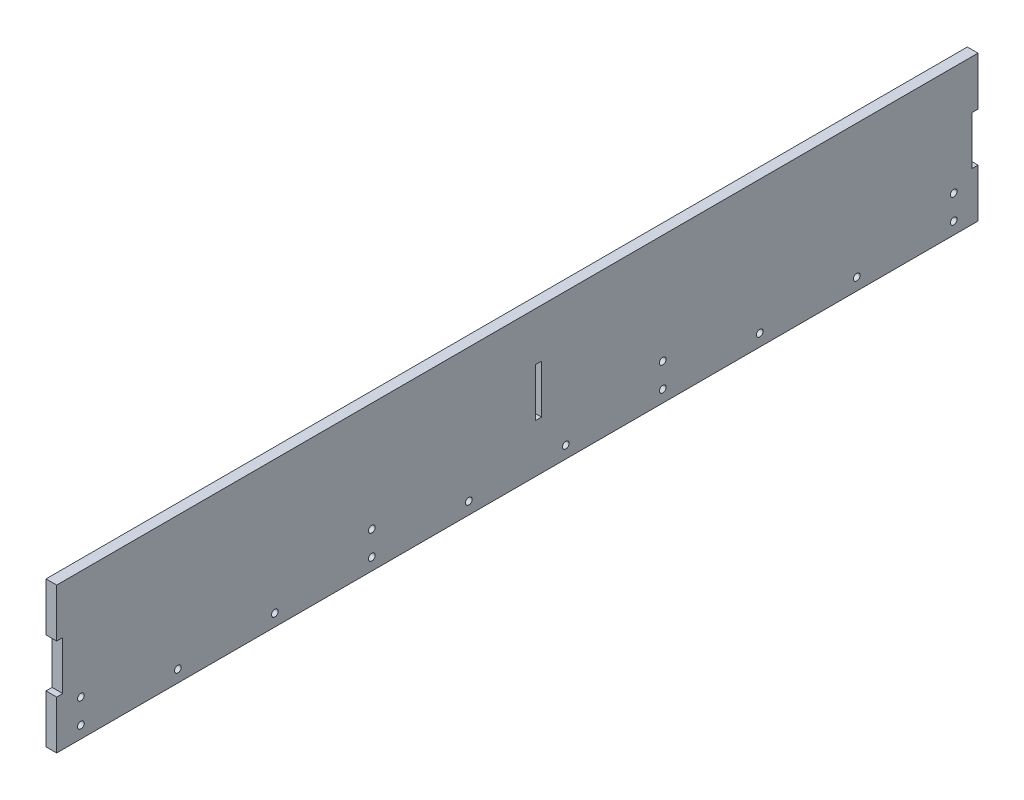
ISO-10303-21;
HEADER;
FILE_DESCRIPTION(('STEP AP214'),'2;1');
FILE_NAME('part.step','',(''),(''),'','','');
FILE_SCHEMA(('AUTOMOTIVE_DESIGN { 1 0 10303 214 1 1 1 1 }'));
ENDSEC;
DATA;
#1=APPLICATION_CONTEXT('core data for automotive mechanical design processes');
#2=APPLICATION_PROTOCOL_DEFINITION('international standard','automotive_design',2000,#1);
#3=PRODUCT_CONTEXT('',#1,'mechanical');
#4=PRODUCT('Part','Part','',(#3));
#5=PRODUCT_RELATED_PRODUCT_CATEGORY('part','',(#4));
#6=PRODUCT_DEFINITION_FORMATION('','',#4);
#7=PRODUCT_DEFINITION_CONTEXT('part definition',#1,'design');
#8=PRODUCT_DEFINITION('design','',#6,#7);
#9=PRODUCT_DEFINITION_SHAPE('','',#8);
#10=(LENGTH_UNIT() NAMED_UNIT(*) SI_UNIT(.MILLI.,.METRE.));
#11=(NAMED_UNIT(*) PLANE_ANGLE_UNIT() SI_UNIT($,.RADIAN.));
#12=(NAMED_UNIT(*) SI_UNIT($,.STERADIAN.) SOLID_ANGLE_UNIT());
#13=UNCERTAINTY_MEASURE_WITH_UNIT(LENGTH_MEASURE(1.E-05),#10,'distance_accuracy_value','');
#14=(GEOMETRIC_REPRESENTATION_CONTEXT(3) GLOBAL_UNCERTAINTY_ASSIGNED_CONTEXT((#13)) GLOBAL_UNIT_ASSIGNED_CONTEXT((#10,
#11,#12)) REPRESENTATION_CONTEXT('',''));
#15=CARTESIAN_POINT('',(0.,0.,0.));
#16=DIRECTION('',(0.,0.,1.));
#17=DIRECTION('',(1.,0.,0.));
#18=AXIS2_PLACEMENT_3D('',#15,#16,#17);
#19=CARTESIAN_POINT('',(88.9,-85.7250000000001,-196.85));
#20=DIRECTION('',(0.,0.,1.));
#21=DIRECTION('',(0.,-1.,0.));
#22=AXIS2_PLACEMENT_3D('',#19,#20,#21);
#23=PLANE('',#22);
#24=DIRECTION('',(0.,-1.,0.));
#25=VECTOR('',#24,1.);
#26=CARTESIAN_POINT('',(94.488,-85.7250000000001,-196.85));
#27=LINE('',#26,#25);
#28=CARTESIAN_POINT('',(94.488,-60.325,-196.85));
#29=VERTEX_POINT('',#28);
#30=CARTESIAN_POINT('',(94.488,-85.7250000000001,-196.85));
#31=VERTEX_POINT('',#30);
#32=EDGE_CURVE('E181',#29,#31,#27,.T.);
#33=ORIENTED_EDGE('',*,*,#32,.F.);
#34=DIRECTION('',(1.,0.,0.));
#35=VECTOR('',#34,1.);
#36=CARTESIAN_POINT('',(88.9,-60.325,-196.85));
#37=LINE('',#36,#35);
#38=CARTESIAN_POINT('',(88.9,-60.325,-196.85));
#39=VERTEX_POINT('',#38);
#40=EDGE_CURVE('E11',#39,#29,#37,.T.);
#41=ORIENTED_EDGE('',*,*,#40,.F.);
#42=DIRECTION('',(0.,-1.,0.));
#43=VECTOR('',#42,1.);
#44=CARTESIAN_POINT('',(88.9,-85.7250000000001,-196.85));
#45=LINE('',#44,#43);
#46=CARTESIAN_POINT('',(88.9,-85.7250000000001,-196.85));
#47=VERTEX_POINT('',#46);
#48=EDGE_CURVE('E185',#39,#47,#45,.T.);
#49=ORIENTED_EDGE('',*,*,#48,.T.);
#50=DIRECTION('',(1.,0.,0.));
#51=VECTOR('',#50,1.);
#52=CARTESIAN_POINT('',(88.9,-85.7250000000001,-196.85));
#53=LINE('',#52,#51);
#54=EDGE_CURVE('E222',#47,#31,#53,.T.);
#55=ORIENTED_EDGE('',*,*,#54,.T.);
#56=EDGE_LOOP('',(#33,#41,#49,#55));
#57=FACE_BOUND('',#56,.T.);
#58=ADVANCED_FACE('F32',(#57),#23,.T.);
#59=CARTESIAN_POINT('',(88.9,-60.325,-196.85));
#60=DIRECTION('',(0.,1.,0.));
#61=DIRECTION('',(0.,0.,1.));
#62=AXIS2_PLACEMENT_3D('',#59,#60,#61);
#63=PLANE('',#62);
#64=DIRECTION('',(0.,0.,1.));
#65=VECTOR('',#64,1.);
#66=CARTESIAN_POINT('',(94.488,-60.325,-196.85));
#67=LINE('',#66,#65);
#68=CARTESIAN_POINT('',(94.488,-60.325,-679.45));
#69=VERTEX_POINT('',#68);
#70=EDGE_CURVE('E189',#69,#29,#67,.T.);
#71=ORIENTED_EDGE('',*,*,#70,.F.);
#72=DIRECTION('',(1.,0.,0.));
#73=VECTOR('',#72,1.);
#74=CARTESIAN_POINT('',(88.9,-60.325,-679.45));
#75=LINE('',#74,#73);
#76=CARTESIAN_POINT('',(88.9,-60.325,-679.45));
#77=VERTEX_POINT('',#76);
#78=EDGE_CURVE('E40',#77,#69,#75,.T.);
#79=ORIENTED_EDGE('',*,*,#78,.F.);
#80=DIRECTION('',(0.,0.,1.));
#81=VECTOR('',#80,1.);
#82=CARTESIAN_POINT('',(88.9,-60.325,-196.85));
#83=LINE('',#82,#81);
#84=EDGE_CURVE('E219',#77,#39,#83,.T.);
#85=ORIENTED_EDGE('',*,*,#84,.T.);
#86=ORIENTED_EDGE('',*,*,#40,.T.);
#87=EDGE_LOOP('',(#71,#79,#85,#86));
#88=FACE_BOUND('',#87,.T.);
#89=ADVANCED_FACE('F417',(#88),#63,.T.);
#90=CARTESIAN_POINT('',(88.9,-60.325,-679.45));
#91=DIRECTION('',(0.,0.,-1.));
#92=DIRECTION('',(0.,1.,0.));
#93=AXIS2_PLACEMENT_3D('',#90,#91,#92);
#94=PLANE('',#93);
#95=DIRECTION('',(0.,1.,0.));
#96=VECTOR('',#95,1.);
#97=CARTESIAN_POINT('',(94.488,-60.325,-679.45));
#98=LINE('',#97,#96);
#99=CARTESIAN_POINT('',(94.488,-85.7250000000001,-679.45));
#100=VERTEX_POINT('',#99);
#101=EDGE_CURVE('E252',#100,#69,#98,.T.);
#102=ORIENTED_EDGE('',*,*,#101,.F.);
#103=DIRECTION('',(1.,0.,0.));
#104=VECTOR('',#103,1.);
#105=CARTESIAN_POINT('',(88.9,-85.7250000000001,-679.45));
#106=LINE('',#105,#104);
#107=CARTESIAN_POINT('',(88.9,-85.7250000000001,-679.45));
#108=VERTEX_POINT('',#107);
#109=EDGE_CURVE('E258',#108,#100,#106,.T.);
#110=ORIENTED_EDGE('',*,*,#109,.F.);
#111=DIRECTION('',(0.,1.,0.));
#112=VECTOR('',#111,1.);
#113=CARTESIAN_POINT('',(88.9,-60.325,-679.45));
#114=LINE('',#113,#112);
#115=EDGE_CURVE('E216',#108,#77,#114,.T.);
#116=ORIENTED_EDGE('',*,*,#115,.T.);
#117=ORIENTED_EDGE('',*,*,#78,.T.);
#118=EDGE_LOOP('',(#102,#110,#116,#117));
#119=FACE_BOUND('',#118,.T.);
#120=ADVANCED_FACE('F414',(#119),#94,.T.);
#121=CARTESIAN_POINT('',(88.9,-85.7250000000001,-679.45));
#122=DIRECTION('',(0.,-1.,0.));
#123=DIRECTION('',(0.,0.,-1.));
#124=AXIS2_PLACEMENT_3D('',#121,#122,#123);
#125=PLANE('',#124);
#126=DIRECTION('',(0.,0.,-1.));
#127=VECTOR('',#126,1.);
#128=CARTESIAN_POINT('',(94.488,-85.7250000000001,-679.45));
#129=LINE('',#128,#127);
#130=CARTESIAN_POINT('',(94.488,-85.7250000000001,-676.275));
#131=VERTEX_POINT('',#130);
#132=EDGE_CURVE('E249',#131,#100,#129,.T.);
#133=ORIENTED_EDGE('',*,*,#132,.F.);
#134=DIRECTION('',(1.,0.,0.));
#135=VECTOR('',#134,1.);
#136=CARTESIAN_POINT('',(88.9,-85.7250000000001,-676.275));
#137=LINE('',#136,#135);
#138=CARTESIAN_POINT('',(88.9,-85.7250000000001,-676.275));
#139=VERTEX_POINT('',#138);
#140=EDGE_CURVE('E260',#139,#131,#137,.T.);
#141=ORIENTED_EDGE('',*,*,#140,.F.);
#142=DIRECTION('',(0.,0.,-1.));
#143=VECTOR('',#142,1.);
#144=CARTESIAN_POINT('',(88.9,-85.7250000000001,-679.45));
#145=LINE('',#144,#143);
#146=EDGE_CURVE('E213',#139,#108,#145,.T.);
#147=ORIENTED_EDGE('',*,*,#146,.T.);
#148=ORIENTED_EDGE('',*,*,#109,.T.);
#149=EDGE_LOOP('',(#133,#141,#147,#148));
#150=FACE_BOUND('',#149,.T.);
#151=ADVANCED_FACE('F410',(#150),#125,.T.);
#152=CARTESIAN_POINT('',(88.9,-85.7250000000001,-676.275));
#153=DIRECTION('',(0.,0.,-1.));
#154=DIRECTION('',(-1.,0.,0.));
#155=AXIS2_PLACEMENT_3D('',#152,#153,#154);
#156=PLANE('',#155);
#157=DIRECTION('',(0.,1.,0.));
#158=VECTOR('',#157,1.);
#159=CARTESIAN_POINT('',(94.488,-85.7250000000001,-676.275));
#160=LINE('',#159,#158);
#161=CARTESIAN_POINT('',(94.488,-111.125,-676.275));
#162=VERTEX_POINT('',#161);
#163=EDGE_CURVE('E246',#162,#131,#160,.T.);
#164=ORIENTED_EDGE('',*,*,#163,.F.);
#165=DIRECTION('',(1.,0.,0.));
#166=VECTOR('',#165,1.);
#167=CARTESIAN_POINT('',(88.9,-111.125,-676.275));
#168=LINE('',#167,#166);
#169=CARTESIAN_POINT('',(88.9,-111.125,-676.275));
#170=VERTEX_POINT('',#169);
#171=EDGE_CURVE('E262',#170,#162,#168,.T.);
#172=ORIENTED_EDGE('',*,*,#171,.F.);
#173=DIRECTION('',(0.,1.,0.));
#174=VECTOR('',#173,1.);
#175=CARTESIAN_POINT('',(88.9,-85.7250000000001,-676.275));
#176=LINE('',#175,#174);
#177=EDGE_CURVE('E210',#170,#139,#176,.T.);
#178=ORIENTED_EDGE('',*,*,#177,.T.);
#179=ORIENTED_EDGE('',*,*,#140,.T.);
#180=EDGE_LOOP('',(#164,#172,#178,#179));
#181=FACE_BOUND('',#180,.T.);
#182=ADVANCED_FACE('F406',(#181),#156,.T.);
#183=CARTESIAN_POINT('',(88.9,-111.125,-676.275));
#184=DIRECTION('',(0.,1.,0.));
#185=DIRECTION('',(0.,0.,1.));
#186=AXIS2_PLACEMENT_3D('',#183,#184,#185);
#187=PLANE('',#186);
#188=DIRECTION('',(0.,0.,1.));
#189=VECTOR('',#188,1.);
#190=CARTESIAN_POINT('',(94.488,-111.125,-676.275));
#191=LINE('',#190,#189);
#192=CARTESIAN_POINT('',(94.488,-111.125,-679.45));
#193=VERTEX_POINT('',#192);
#194=EDGE_CURVE('E243',#193,#162,#191,.T.);
#195=ORIENTED_EDGE('',*,*,#194,.F.);
#196=DIRECTION('',(1.,0.,0.));
#197=VECTOR('',#196,1.);
#198=CARTESIAN_POINT('',(88.9,-111.125,-679.45));
#199=LINE('',#198,#197);
#200=CARTESIAN_POINT('',(88.9,-111.125,-679.45));
#201=VERTEX_POINT('',#200);
#202=EDGE_CURVE('E264',#201,#193,#199,.T.);
#203=ORIENTED_EDGE('',*,*,#202,.F.);
#204=DIRECTION('',(0.,0.,1.));
#205=VECTOR('',#204,1.);
#206=CARTESIAN_POINT('',(88.9,-111.125,-676.275));
#207=LINE('',#206,#205);
#208=EDGE_CURVE('E207',#201,#170,#207,.T.);
#209=ORIENTED_EDGE('',*,*,#208,.T.);
#210=ORIENTED_EDGE('',*,*,#171,.T.);
#211=EDGE_LOOP('',(#195,#203,#209,#210));
#212=FACE_BOUND('',#211,.T.);
#213=ADVANCED_FACE('F402',(#212),#187,.T.);
#214=CARTESIAN_POINT('',(88.9,-136.525,-679.45));
#215=DIRECTION('',(0.,0.,-1.));
#216=DIRECTION('',(0.,1.,0.));
#217=AXIS2_PLACEMENT_3D('',#214,#215,#216);
#218=PLANE('',#217);
#219=DIRECTION('',(0.,1.,0.));
#220=VECTOR('',#219,1.);
#221=CARTESIAN_POINT('',(94.488,-136.525,-679.45));
#222=LINE('',#221,#220);
#223=CARTESIAN_POINT('',(94.488,-136.525,-679.45));
#224=VERTEX_POINT('',#223);
#225=EDGE_CURVE('E240',#224,#193,#222,.T.);
#226=ORIENTED_EDGE('',*,*,#225,.F.);
#227=DIRECTION('',(1.,0.,0.));
#228=VECTOR('',#227,1.);
#229=CARTESIAN_POINT('',(88.9,-136.525,-679.45));
#230=LINE('',#229,#228);
#231=CARTESIAN_POINT('',(88.9,-136.525,-679.45));
#232=VERTEX_POINT('',#231);
#233=EDGE_CURVE('E266',#232,#224,#230,.T.);
#234=ORIENTED_EDGE('',*,*,#233,.F.);
#235=DIRECTION('',(0.,1.,0.));
#236=VECTOR('',#235,1.);
#237=CARTESIAN_POINT('',(88.9,-136.525,-679.45));
#238=LINE('',#237,#236);
#239=EDGE_CURVE('E204',#232,#201,#238,.T.);
#240=ORIENTED_EDGE('',*,*,#239,.T.);
#241=ORIENTED_EDGE('',*,*,#202,.T.);
#242=EDGE_LOOP('',(#226,#234,#240,#241));
#243=FACE_BOUND('',#242,.T.);
#244=ADVANCED_FACE('F398',(#243),#218,.T.);
#245=CARTESIAN_POINT('',(88.9,-136.525,-196.85));
#246=DIRECTION('',(0.,-1.,0.));
#247=DIRECTION('',(0.,0.,-1.));
#248=AXIS2_PLACEMENT_3D('',#245,#246,#247);
#249=PLANE('',#248);
#250=DIRECTION('',(0.,0.,-1.));
#251=VECTOR('',#250,1.);
#252=CARTESIAN_POINT('',(94.488,-136.525,-196.85));
#253=LINE('',#252,#251);
#254=CARTESIAN_POINT('',(94.488,-136.525,-196.85));
#255=VERTEX_POINT('',#254);
#256=EDGE_CURVE('E237',#255,#224,#253,.T.);
#257=ORIENTED_EDGE('',*,*,#256,.F.);
#258=DIRECTION('',(1.,0.,0.));
#259=VECTOR('',#258,1.);
#260=CARTESIAN_POINT('',(88.9,-136.525,-196.85));
#261=LINE('',#260,#259);
#262=CARTESIAN_POINT('',(88.9,-136.525,-196.85));
#263=VERTEX_POINT('',#262);
#264=EDGE_CURVE('E268',#263,#255,#261,.T.);
#265=ORIENTED_EDGE('',*,*,#264,.F.);
#266=DIRECTION('',(0.,0.,-1.));
#267=VECTOR('',#266,1.);
#268=CARTESIAN_POINT('',(88.9,-136.525,-196.85));
#269=LINE('',#268,#267);
#270=EDGE_CURVE('E201',#263,#232,#269,.T.);
#271=ORIENTED_EDGE('',*,*,#270,.T.);
#272=ORIENTED_EDGE('',*,*,#233,.T.);
#273=EDGE_LOOP('',(#257,#265,#271,#272));
#274=FACE_BOUND('',#273,.T.);
#275=ADVANCED_FACE('F394',(#274),#249,.T.);
#276=CARTESIAN_POINT('',(88.9,-111.125,-196.85));
#277=DIRECTION('',(0.,0.,1.));
#278=DIRECTION('',(0.,-1.,0.));
#279=AXIS2_PLACEMENT_3D('',#276,#277,#278);
#280=PLANE('',#279);
#281=DIRECTION('',(0.,-1.,0.));
#282=VECTOR('',#281,1.);
#283=CARTESIAN_POINT('',(94.488,-111.125,-196.85));
#284=LINE('',#283,#282);
#285=CARTESIAN_POINT('',(94.488,-111.125,-196.85));
#286=VERTEX_POINT('',#285);
#287=EDGE_CURVE('E234',#286,#255,#284,.T.);
#288=ORIENTED_EDGE('',*,*,#287,.F.);
#289=DIRECTION('',(1.,0.,0.));
#290=VECTOR('',#289,1.);
#291=CARTESIAN_POINT('',(88.9,-111.125,-196.85));
#292=LINE('',#291,#290);
#293=CARTESIAN_POINT('',(88.9,-111.125,-196.85));
#294=VERTEX_POINT('',#293);
#295=EDGE_CURVE('E270',#294,#286,#292,.T.);
#296=ORIENTED_EDGE('',*,*,#295,.F.);
#297=DIRECTION('',(0.,-1.,0.));
#298=VECTOR('',#297,1.);
#299=CARTESIAN_POINT('',(88.9,-111.125,-196.85));
#300=LINE('',#299,#298);
#301=EDGE_CURVE('E198',#294,#263,#300,.T.);
#302=ORIENTED_EDGE('',*,*,#301,.T.);
#303=ORIENTED_EDGE('',*,*,#264,.T.);
#304=EDGE_LOOP('',(#288,#296,#302,#303));
#305=FACE_BOUND('',#304,.T.);
#306=ADVANCED_FACE('F390',(#305),#280,.T.);
#307=CARTESIAN_POINT('',(88.9,-111.125,-196.85));
#308=DIRECTION('',(0.,1.,0.));
#309=DIRECTION('',(0.,0.,1.));
#310=AXIS2_PLACEMENT_3D('',#307,#308,#309);
#311=PLANE('',#310);
#312=DIRECTION('',(0.,0.,1.));
#313=VECTOR('',#312,1.);
#314=CARTESIAN_POINT('',(94.488,-111.125,-196.85));
#315=LINE('',#314,#313);
#316=CARTESIAN_POINT('',(94.488,-111.125,-200.025));
#317=VERTEX_POINT('',#316);
#318=EDGE_CURVE('E231',#317,#286,#315,.T.);
#319=ORIENTED_EDGE('',*,*,#318,.F.);
#320=DIRECTION('',(1.,0.,0.));
#321=VECTOR('',#320,1.);
#322=CARTESIAN_POINT('',(88.9,-111.125,-200.025));
#323=LINE('',#322,#321);
#324=CARTESIAN_POINT('',(88.9,-111.125,-200.025));
#325=VERTEX_POINT('',#324);
#326=EDGE_CURVE('E272',#325,#317,#323,.T.);
#327=ORIENTED_EDGE('',*,*,#326,.F.);
#328=DIRECTION('',(0.,0.,1.));
#329=VECTOR('',#328,1.);
#330=CARTESIAN_POINT('',(88.9,-111.125,-196.85));
#331=LINE('',#330,#329);
#332=EDGE_CURVE('E195',#325,#294,#331,.T.);
#333=ORIENTED_EDGE('',*,*,#332,.T.);
#334=ORIENTED_EDGE('',*,*,#295,.T.);
#335=EDGE_LOOP('',(#319,#327,#333,#334));
#336=FACE_BOUND('',#335,.T.);
#337=ADVANCED_FACE('F386',(#336),#311,.T.);
#338=CARTESIAN_POINT('',(88.9,-111.125,-200.025));
#339=DIRECTION('',(0.,0.,1.));
#340=DIRECTION('',(1.,0.,0.));
#341=AXIS2_PLACEMENT_3D('',#338,#339,#340);
#342=PLANE('',#341);
#343=DIRECTION('',(0.,-1.,0.));
#344=VECTOR('',#343,1.);
#345=CARTESIAN_POINT('',(94.488,-111.125,-200.025));
#346=LINE('',#345,#344);
#347=CARTESIAN_POINT('',(94.488,-85.7250000000001,-200.025));
#348=VERTEX_POINT('',#347);
#349=EDGE_CURVE('E228',#348,#317,#346,.T.);
#350=ORIENTED_EDGE('',*,*,#349,.F.);
#351=DIRECTION('',(1.,0.,0.));
#352=VECTOR('',#351,1.);
#353=CARTESIAN_POINT('',(88.9,-85.7250000000001,-200.025));
#354=LINE('',#353,#352);
#355=CARTESIAN_POINT('',(88.9,-85.7250000000001,-200.025));
#356=VERTEX_POINT('',#355);
#357=EDGE_CURVE('E274',#356,#348,#354,.T.);
#358=ORIENTED_EDGE('',*,*,#357,.F.);
#359=DIRECTION('',(0.,-1.,0.));
#360=VECTOR('',#359,1.);
#361=CARTESIAN_POINT('',(88.9,-111.125,-200.025));
#362=LINE('',#361,#360);
#363=EDGE_CURVE('E192',#356,#325,#362,.T.);
#364=ORIENTED_EDGE('',*,*,#363,.T.);
#365=ORIENTED_EDGE('',*,*,#326,.T.);
#366=EDGE_LOOP('',(#350,#358,#364,#365));
#367=FACE_BOUND('',#366,.T.);
#368=ADVANCED_FACE('F382',(#367),#342,.T.);
#369=CARTESIAN_POINT('',(88.9,-85.7250000000001,-200.025));
#370=DIRECTION('',(0.,-1.,0.));
#371=DIRECTION('',(0.,0.,-1.));
#372=AXIS2_PLACEMENT_3D('',#369,#370,#371);
#373=PLANE('',#372);
#374=DIRECTION('',(0.,0.,-1.));
#375=VECTOR('',#374,1.);
#376=CARTESIAN_POINT('',(94.488,-85.7250000000001,-200.025));
#377=LINE('',#376,#375);
#378=EDGE_CURVE('E225',#31,#348,#377,.T.);
#379=ORIENTED_EDGE('',*,*,#378,.F.);
#380=ORIENTED_EDGE('',*,*,#54,.F.);
#381=DIRECTION('',(0.,0.,-1.));
#382=VECTOR('',#381,1.);
#383=CARTESIAN_POINT('',(88.9,-85.7250000000001,-200.025));
#384=LINE('',#383,#382);
#385=EDGE_CURVE('E188',#47,#356,#384,.T.);
#386=ORIENTED_EDGE('',*,*,#385,.T.);
#387=ORIENTED_EDGE('',*,*,#357,.T.);
#388=EDGE_LOOP('',(#379,#380,#386,#387));
#389=FACE_BOUND('',#388,.T.);
#390=ADVANCED_FACE('F352',(#389),#373,.T.);
#391=CARTESIAN_POINT('',(88.9,0.,0.));
#392=DIRECTION('',(-1.,0.,0.));
#393=DIRECTION('',(0.,0.,1.));
#394=AXIS2_PLACEMENT_3D('',#391,#392,#393);
#395=PLANE('',#394);
#396=CARTESIAN_POINT('',(88.9,-130.175,-209.55));
#397=DIRECTION('',(-1.,0.,0.));
#398=DIRECTION('',(0.,0.,1.));
#399=AXIS2_PLACEMENT_3D('',#396,#397,#398);
#400=CIRCLE('',#399,1.7526);
#401=CARTESIAN_POINT('',(88.9,-130.175,-207.7974));
#402=VERTEX_POINT('',#401);
#403=EDGE_CURVE('E281',#402,#402,#400,.T.);
#404=ORIENTED_EDGE('',*,*,#403,.F.);
#405=EDGE_LOOP('',(#404));
#406=FACE_BOUND('',#405,.T.);
#407=CARTESIAN_POINT('',(88.9,-130.175,-260.35));
#408=DIRECTION('',(-1.,0.,0.));
#409=DIRECTION('',(0.,0.,1.));
#410=AXIS2_PLACEMENT_3D('',#407,#408,#409);
#411=CIRCLE('',#410,1.75260000000004);
#412=CARTESIAN_POINT('',(88.9,-130.175,-258.5974));
#413=VERTEX_POINT('',#412);
#414=EDGE_CURVE('E326',#413,#413,#411,.T.);
#415=ORIENTED_EDGE('',*,*,#414,.F.);
#416=EDGE_LOOP('',(#415));
#417=FACE_BOUND('',#416,.T.);
#418=CARTESIAN_POINT('',(88.9,-130.175,-311.15));
#419=DIRECTION('',(-1.,0.,0.));
#420=DIRECTION('',(0.,0.,1.));
#421=AXIS2_PLACEMENT_3D('',#418,#419,#420);
#422=CIRCLE('',#421,1.75259999999998);
#423=CARTESIAN_POINT('',(88.9,-130.175,-309.3974));
#424=VERTEX_POINT('',#423);
#425=EDGE_CURVE('E323',#424,#424,#422,.T.);
#426=ORIENTED_EDGE('',*,*,#425,.F.);
#427=EDGE_LOOP('',(#426));
#428=FACE_BOUND('',#427,.T.);
#429=CARTESIAN_POINT('',(88.9,-130.175,-361.95));
#430=DIRECTION('',(-1.,0.,0.));
#431=DIRECTION('',(0.,0.,1.));
#432=AXIS2_PLACEMENT_3D('',#429,#430,#431);
#433=CIRCLE('',#432,1.75259999999998);
#434=CARTESIAN_POINT('',(88.9,-130.175,-360.1974));
#435=VERTEX_POINT('',#434);
#436=EDGE_CURVE('E320',#435,#435,#433,.T.);
#437=ORIENTED_EDGE('',*,*,#436,.F.);
#438=EDGE_LOOP('',(#437));
#439=FACE_BOUND('',#438,.T.);
#440=CARTESIAN_POINT('',(88.9,-130.175,-412.75));
#441=DIRECTION('',(-1.,0.,0.));
#442=DIRECTION('',(0.,0.,1.));
#443=AXIS2_PLACEMENT_3D('',#440,#441,#442);
#444=CIRCLE('',#443,1.75260000000004);
#445=CARTESIAN_POINT('',(88.9,-130.175,-410.9974));
#446=VERTEX_POINT('',#445);
#447=EDGE_CURVE('E316',#446,#446,#444,.T.);
#448=ORIENTED_EDGE('',*,*,#447,.F.);
#449=EDGE_LOOP('',(#448));
#450=FACE_BOUND('',#449,.T.);
#451=CARTESIAN_POINT('',(88.9,-130.175,-463.55));
#452=DIRECTION('',(-1.,0.,0.));
#453=DIRECTION('',(0.,0.,1.));
#454=AXIS2_PLACEMENT_3D('',#451,#452,#453);
#455=CIRCLE('',#454,1.75259999999998);
#456=CARTESIAN_POINT('',(88.9,-130.175,-461.7974));
#457=VERTEX_POINT('',#456);
#458=EDGE_CURVE('E312',#457,#457,#455,.T.);
#459=ORIENTED_EDGE('',*,*,#458,.F.);
#460=EDGE_LOOP('',(#459));
#461=FACE_BOUND('',#460,.T.);
#462=CARTESIAN_POINT('',(88.9,-130.175,-514.35));
#463=DIRECTION('',(-1.,0.,0.));
#464=DIRECTION('',(0.,0.,1.));
#465=AXIS2_PLACEMENT_3D('',#462,#463,#464);
#466=CIRCLE('',#465,1.75260000000003);
#467=CARTESIAN_POINT('',(88.9,-130.175,-512.5974));
#468=VERTEX_POINT('',#467);
#469=EDGE_CURVE('E308',#468,#468,#466,.T.);
#470=ORIENTED_EDGE('',*,*,#469,.F.);
#471=EDGE_LOOP('',(#470));
#472=FACE_BOUND('',#471,.T.);
#473=CARTESIAN_POINT('',(88.9,-130.175,-565.15));
#474=DIRECTION('',(-1.,0.,0.));
#475=DIRECTION('',(0.,0.,1.));
#476=AXIS2_PLACEMENT_3D('',#473,#474,#475);
#477=CIRCLE('',#476,1.75260000000003);
#478=CARTESIAN_POINT('',(88.9,-130.175,-563.3974));
#479=VERTEX_POINT('',#478);
#480=EDGE_CURVE('E304',#479,#479,#477,.T.);
#481=ORIENTED_EDGE('',*,*,#480,.F.);
#482=EDGE_LOOP('',(#481));
#483=FACE_BOUND('',#482,.T.);
#484=CARTESIAN_POINT('',(88.9,-130.175,-615.95));
#485=DIRECTION('',(-1.,0.,0.));
#486=DIRECTION('',(0.,0.,1.));
#487=AXIS2_PLACEMENT_3D('',#484,#485,#486);
#488=CIRCLE('',#487,1.75259999999991);
#489=CARTESIAN_POINT('',(88.9,-130.175,-614.1974));
#490=VERTEX_POINT('',#489);
#491=EDGE_CURVE('E300',#490,#490,#488,.T.);
#492=ORIENTED_EDGE('',*,*,#491,.F.);
#493=EDGE_LOOP('',(#492));
#494=FACE_BOUND('',#493,.T.);
#495=CARTESIAN_POINT('',(88.9,-130.175,-666.75));
#496=DIRECTION('',(-1.,0.,0.));
#497=DIRECTION('',(0.,0.,1.));
#498=AXIS2_PLACEMENT_3D('',#495,#496,#497);
#499=CIRCLE('',#498,1.75260000000003);
#500=CARTESIAN_POINT('',(88.9,-130.175,-664.9974));
#501=VERTEX_POINT('',#500);
#502=EDGE_CURVE('E296',#501,#501,#499,.T.);
#503=ORIENTED_EDGE('',*,*,#502,.F.);
#504=EDGE_LOOP('',(#503));
#505=FACE_BOUND('',#504,.T.);
#506=CARTESIAN_POINT('',(88.9,-117.475,-209.55));
#507=DIRECTION('',(-1.,0.,0.));
#508=DIRECTION('',(0.,0.,1.));
#509=AXIS2_PLACEMENT_3D('',#506,#507,#508);
#510=CIRCLE('',#509,1.75259999999998);
#511=CARTESIAN_POINT('',(88.9,-117.475,-207.7974));
#512=VERTEX_POINT('',#511);
#513=EDGE_CURVE('E169',#512,#512,#510,.T.);
#514=ORIENTED_EDGE('',*,*,#513,.F.);
#515=EDGE_LOOP('',(#514));
#516=FACE_BOUND('',#515,.T.);
#517=CARTESIAN_POINT('',(88.9,-117.475,-361.95));
#518=DIRECTION('',(-1.,0.,0.));
#519=DIRECTION('',(0.,0.,1.));
#520=AXIS2_PLACEMENT_3D('',#517,#518,#519);
#521=CIRCLE('',#520,1.75260000000003);
#522=CARTESIAN_POINT('',(88.9,-117.475,-360.1974));
#523=VERTEX_POINT('',#522);
#524=EDGE_CURVE('E289',#523,#523,#521,.T.);
#525=ORIENTED_EDGE('',*,*,#524,.F.);
#526=EDGE_LOOP('',(#525));
#527=FACE_BOUND('',#526,.T.);
#528=CARTESIAN_POINT('',(88.9,-117.475,-514.35));
#529=DIRECTION('',(-1.,0.,0.));
#530=DIRECTION('',(0.,0.,1.));
#531=AXIS2_PLACEMENT_3D('',#528,#529,#530);
#532=CIRCLE('',#531,1.75260000000003);
#533=CARTESIAN_POINT('',(88.9,-117.475,-512.5974));
#534=VERTEX_POINT('',#533);
#535=EDGE_CURVE('E285',#534,#534,#532,.T.);
#536=ORIENTED_EDGE('',*,*,#535,.F.);
#537=EDGE_LOOP('',(#536));
#538=FACE_BOUND('',#537,.T.);
#539=CARTESIAN_POINT('',(88.9,-117.475,-666.75));
#540=DIRECTION('',(-1.,0.,0.));
#541=DIRECTION('',(0.,0.,1.));
#542=AXIS2_PLACEMENT_3D('',#539,#540,#541);
#543=CIRCLE('',#542,1.75260000000003);
#544=CARTESIAN_POINT('',(88.9,-117.475,-664.9974));
#545=VERTEX_POINT('',#544);
#546=EDGE_CURVE('E280',#545,#545,#543,.T.);
#547=ORIENTED_EDGE('',*,*,#546,.F.);
#548=EDGE_LOOP('',(#547));
#549=FACE_BOUND('',#548,.T.);
#550=DIRECTION('',(0.,0.,-1.));
#551=VECTOR('',#550,1.);
#552=CARTESIAN_POINT('',(88.9,-111.125,-447.675));
#553=LINE('',#552,#551);
#554=CARTESIAN_POINT('',(88.9,-111.125,-447.675));
#555=VERTEX_POINT('',#554);
#556=CARTESIAN_POINT('',(88.9,-111.125,-450.85));
#557=VERTEX_POINT('',#556);
#558=EDGE_CURVE('E147',#555,#557,#553,.T.);
#559=ORIENTED_EDGE('',*,*,#558,.T.);
#560=DIRECTION('',(0.,1.,0.));
#561=VECTOR('',#560,1.);
#562=CARTESIAN_POINT('',(88.9,-111.125,-450.85));
#563=LINE('',#562,#561);
#564=CARTESIAN_POINT('',(88.9,-85.725,-450.85));
#565=VERTEX_POINT('',#564);
#566=EDGE_CURVE('E156',#557,#565,#563,.T.);
#567=ORIENTED_EDGE('',*,*,#566,.T.);
#568=DIRECTION('',(0.,0.,1.));
#569=VECTOR('',#568,1.);
#570=CARTESIAN_POINT('',(88.9,-85.725,-450.85));
#571=LINE('',#570,#569);
#572=CARTESIAN_POINT('',(88.9,-85.725,-447.675));
#573=VERTEX_POINT('',#572);
#574=EDGE_CURVE('E48',#565,#573,#571,.T.);
#575=ORIENTED_EDGE('',*,*,#574,.T.);
#576=DIRECTION('',(0.,-1.,0.));
#577=VECTOR('',#576,1.);
#578=CARTESIAN_POINT('',(88.9,-85.725,-447.675));
#579=LINE('',#578,#577);
#580=EDGE_CURVE('E153',#573,#555,#579,.T.);
#581=ORIENTED_EDGE('',*,*,#580,.T.);
#582=EDGE_LOOP('',(#559,#567,#575,#581));
#583=FACE_BOUND('',#582,.T.);
#584=ORIENTED_EDGE('',*,*,#48,.F.);
#585=ORIENTED_EDGE('',*,*,#84,.F.);
#586=ORIENTED_EDGE('',*,*,#115,.F.);
#587=ORIENTED_EDGE('',*,*,#146,.F.);
#588=ORIENTED_EDGE('',*,*,#177,.F.);
#589=ORIENTED_EDGE('',*,*,#208,.F.);
#590=ORIENTED_EDGE('',*,*,#239,.F.);
#591=ORIENTED_EDGE('',*,*,#270,.F.);
#592=ORIENTED_EDGE('',*,*,#301,.F.);
#593=ORIENTED_EDGE('',*,*,#332,.F.);
#594=ORIENTED_EDGE('',*,*,#363,.F.);
#595=ORIENTED_EDGE('',*,*,#385,.F.);
#596=EDGE_LOOP('',(#584,#585,#586,#587,#588,#589,#590,#591,#592,#593,#594,#595));
#597=FACE_BOUND('',#596,.T.);
#598=ADVANCED_FACE('F160',(#406,#417,#428,#439,#450,#461,#472,#483,#494,#505,#516,#527,#538,
#549,#583,#597),#395,.T.);
#599=CARTESIAN_POINT('',(94.488,0.,0.));
#600=DIRECTION('',(-1.,0.,0.));
#601=DIRECTION('',(0.,0.,1.));
#602=AXIS2_PLACEMENT_3D('',#599,#600,#601);
#603=PLANE('',#602);
#604=CARTESIAN_POINT('',(94.488,-130.175,-209.55));
#605=DIRECTION('',(-1.,0.,0.));
#606=DIRECTION('',(0.,0.,1.));
#607=AXIS2_PLACEMENT_3D('',#604,#605,#606);
#608=CIRCLE('',#607,1.7526);
#609=CARTESIAN_POINT('',(94.488,-130.175,-207.7974));
#610=VERTEX_POINT('',#609);
#611=EDGE_CURVE('E35',#610,#610,#608,.T.);
#612=ORIENTED_EDGE('',*,*,#611,.T.);
#613=EDGE_LOOP('',(#612));
#614=FACE_BOUND('',#613,.T.);
#615=CARTESIAN_POINT('',(94.488,-130.175,-260.35));
#616=DIRECTION('',(-1.,0.,0.));
#617=DIRECTION('',(0.,0.,1.));
#618=AXIS2_PLACEMENT_3D('',#615,#616,#617);
#619=CIRCLE('',#618,1.75260000000004);
#620=CARTESIAN_POINT('',(94.488,-130.175,-258.5974));
#621=VERTEX_POINT('',#620);
#622=EDGE_CURVE('E324',#621,#621,#619,.T.);
#623=ORIENTED_EDGE('',*,*,#622,.T.);
#624=EDGE_LOOP('',(#623));
#625=FACE_BOUND('',#624,.T.);
#626=CARTESIAN_POINT('',(94.488,-130.175,-311.15));
#627=DIRECTION('',(-1.,0.,0.));
#628=DIRECTION('',(0.,0.,1.));
#629=AXIS2_PLACEMENT_3D('',#626,#627,#628);
#630=CIRCLE('',#629,1.75259999999998);
#631=CARTESIAN_POINT('',(94.488,-130.175,-309.3974));
#632=VERTEX_POINT('',#631);
#633=EDGE_CURVE('E321',#632,#632,#630,.T.);
#634=ORIENTED_EDGE('',*,*,#633,.T.);
#635=EDGE_LOOP('',(#634));
#636=FACE_BOUND('',#635,.T.);
#637=CARTESIAN_POINT('',(94.488,-130.175,-361.95));
#638=DIRECTION('',(-1.,0.,0.));
#639=DIRECTION('',(0.,0.,1.));
#640=AXIS2_PLACEMENT_3D('',#637,#638,#639);
#641=CIRCLE('',#640,1.75259999999998);
#642=CARTESIAN_POINT('',(94.488,-130.175,-360.1974));
#643=VERTEX_POINT('',#642);
#644=EDGE_CURVE('E317',#643,#643,#641,.T.);
#645=ORIENTED_EDGE('',*,*,#644,.T.);
#646=EDGE_LOOP('',(#645));
#647=FACE_BOUND('',#646,.T.);
#648=CARTESIAN_POINT('',(94.488,-130.175,-412.75));
#649=DIRECTION('',(-1.,0.,0.));
#650=DIRECTION('',(0.,0.,1.));
#651=AXIS2_PLACEMENT_3D('',#648,#649,#650);
#652=CIRCLE('',#651,1.75260000000004);
#653=CARTESIAN_POINT('',(94.488,-130.175,-410.9974));
#654=VERTEX_POINT('',#653);
#655=EDGE_CURVE('E313',#654,#654,#652,.T.);
#656=ORIENTED_EDGE('',*,*,#655,.T.);
#657=EDGE_LOOP('',(#656));
#658=FACE_BOUND('',#657,.T.);
#659=CARTESIAN_POINT('',(94.488,-130.175,-463.55));
#660=DIRECTION('',(-1.,0.,0.));
#661=DIRECTION('',(0.,0.,1.));
#662=AXIS2_PLACEMENT_3D('',#659,#660,#661);
#663=CIRCLE('',#662,1.75259999999998);
#664=CARTESIAN_POINT('',(94.488,-130.175,-461.7974));
#665=VERTEX_POINT('',#664);
#666=EDGE_CURVE('E309',#665,#665,#663,.T.);
#667=ORIENTED_EDGE('',*,*,#666,.T.);
#668=EDGE_LOOP('',(#667));
#669=FACE_BOUND('',#668,.T.);
#670=CARTESIAN_POINT('',(94.488,-130.175,-514.35));
#671=DIRECTION('',(-1.,0.,0.));
#672=DIRECTION('',(0.,0.,1.));
#673=AXIS2_PLACEMENT_3D('',#670,#671,#672);
#674=CIRCLE('',#673,1.75260000000003);
#675=CARTESIAN_POINT('',(94.488,-130.175,-512.5974));
#676=VERTEX_POINT('',#675);
#677=EDGE_CURVE('E305',#676,#676,#674,.T.);
#678=ORIENTED_EDGE('',*,*,#677,.T.);
#679=EDGE_LOOP('',(#678));
#680=FACE_BOUND('',#679,.T.);
#681=CARTESIAN_POINT('',(94.488,-130.175,-565.15));
#682=DIRECTION('',(-1.,0.,0.));
#683=DIRECTION('',(0.,0.,1.));
#684=AXIS2_PLACEMENT_3D('',#681,#682,#683);
#685=CIRCLE('',#684,1.75260000000003);
#686=CARTESIAN_POINT('',(94.488,-130.175,-563.3974));
#687=VERTEX_POINT('',#686);
#688=EDGE_CURVE('E301',#687,#687,#685,.T.);
#689=ORIENTED_EDGE('',*,*,#688,.T.);
#690=EDGE_LOOP('',(#689));
#691=FACE_BOUND('',#690,.T.);
#692=CARTESIAN_POINT('',(94.488,-130.175,-615.95));
#693=DIRECTION('',(-1.,0.,0.));
#694=DIRECTION('',(0.,0.,1.));
#695=AXIS2_PLACEMENT_3D('',#692,#693,#694);
#696=CIRCLE('',#695,1.75259999999991);
#697=CARTESIAN_POINT('',(94.488,-130.175,-614.1974));
#698=VERTEX_POINT('',#697);
#699=EDGE_CURVE('E297',#698,#698,#696,.T.);
#700=ORIENTED_EDGE('',*,*,#699,.T.);
#701=EDGE_LOOP('',(#700));
#702=FACE_BOUND('',#701,.T.);
#703=CARTESIAN_POINT('',(94.488,-130.175,-666.75));
#704=DIRECTION('',(-1.,0.,0.));
#705=DIRECTION('',(0.,0.,1.));
#706=AXIS2_PLACEMENT_3D('',#703,#704,#705);
#707=CIRCLE('',#706,1.75260000000003);
#708=CARTESIAN_POINT('',(94.488,-130.175,-664.9974));
#709=VERTEX_POINT('',#708);
#710=EDGE_CURVE('E293',#709,#709,#707,.T.);
#711=ORIENTED_EDGE('',*,*,#710,.T.);
#712=EDGE_LOOP('',(#711));
#713=FACE_BOUND('',#712,.T.);
#714=CARTESIAN_POINT('',(94.488,-117.475,-209.55));
#715=DIRECTION('',(-1.,0.,0.));
#716=DIRECTION('',(0.,0.,1.));
#717=AXIS2_PLACEMENT_3D('',#714,#715,#716);
#718=CIRCLE('',#717,1.75259999999998);
#719=CARTESIAN_POINT('',(94.488,-117.475,-207.7974));
#720=VERTEX_POINT('',#719);
#721=EDGE_CURVE('E290',#720,#720,#718,.T.);
#722=ORIENTED_EDGE('',*,*,#721,.T.);
#723=EDGE_LOOP('',(#722));
#724=FACE_BOUND('',#723,.T.);
#725=CARTESIAN_POINT('',(94.488,-117.475,-361.95));
#726=DIRECTION('',(-1.,0.,0.));
#727=DIRECTION('',(0.,0.,1.));
#728=AXIS2_PLACEMENT_3D('',#725,#726,#727);
#729=CIRCLE('',#728,1.75260000000003);
#730=CARTESIAN_POINT('',(94.488,-117.475,-360.1974));
#731=VERTEX_POINT('',#730);
#732=EDGE_CURVE('E286',#731,#731,#729,.T.);
#733=ORIENTED_EDGE('',*,*,#732,.T.);
#734=EDGE_LOOP('',(#733));
#735=FACE_BOUND('',#734,.T.);
#736=CARTESIAN_POINT('',(94.488,-117.475,-514.35));
#737=DIRECTION('',(-1.,0.,0.));
#738=DIRECTION('',(0.,0.,1.));
#739=AXIS2_PLACEMENT_3D('',#736,#737,#738);
#740=CIRCLE('',#739,1.75260000000003);
#741=CARTESIAN_POINT('',(94.488,-117.475,-512.5974));
#742=VERTEX_POINT('',#741);
#743=EDGE_CURVE('E282',#742,#742,#740,.T.);
#744=ORIENTED_EDGE('',*,*,#743,.T.);
#745=EDGE_LOOP('',(#744));
#746=FACE_BOUND('',#745,.T.);
#747=CARTESIAN_POINT('',(94.488,-117.475,-666.75));
#748=DIRECTION('',(-1.,0.,0.));
#749=DIRECTION('',(0.,0.,1.));
#750=AXIS2_PLACEMENT_3D('',#747,#748,#749);
#751=CIRCLE('',#750,1.75260000000003);
#752=CARTESIAN_POINT('',(94.488,-117.475,-664.9974));
#753=VERTEX_POINT('',#752);
#754=EDGE_CURVE('E277',#753,#753,#751,.T.);
#755=ORIENTED_EDGE('',*,*,#754,.T.);
#756=EDGE_LOOP('',(#755));
#757=FACE_BOUND('',#756,.T.);
#758=DIRECTION('',(0.,1.,0.));
#759=VECTOR('',#758,1.);
#760=CARTESIAN_POINT('',(94.488,-111.125,-450.85));
#761=LINE('',#760,#759);
#762=CARTESIAN_POINT('',(94.488,-111.125,-450.85));
#763=VERTEX_POINT('',#762);
#764=CARTESIAN_POINT('',(94.488,-85.725,-450.85));
#765=VERTEX_POINT('',#764);
#766=EDGE_CURVE('E175',#763,#765,#761,.T.);
#767=ORIENTED_EDGE('',*,*,#766,.F.);
#768=DIRECTION('',(0.,0.,-1.));
#769=VECTOR('',#768,1.);
#770=CARTESIAN_POINT('',(94.488,-111.125,-447.675));
#771=LINE('',#770,#769);
#772=CARTESIAN_POINT('',(94.488,-111.125,-447.675));
#773=VERTEX_POINT('',#772);
#774=EDGE_CURVE('E56',#773,#763,#771,.T.);
#775=ORIENTED_EDGE('',*,*,#774,.F.);
#776=DIRECTION('',(0.,-1.,0.));
#777=VECTOR('',#776,1.);
#778=CARTESIAN_POINT('',(94.488,-85.725,-447.675));
#779=LINE('',#778,#777);
#780=CARTESIAN_POINT('',(94.488,-85.725,-447.675));
#781=VERTEX_POINT('',#780);
#782=EDGE_CURVE('E163',#781,#773,#779,.T.);
#783=ORIENTED_EDGE('',*,*,#782,.F.);
#784=DIRECTION('',(0.,0.,1.));
#785=VECTOR('',#784,1.);
#786=CARTESIAN_POINT('',(94.488,-85.725,-450.85));
#787=LINE('',#786,#785);
#788=EDGE_CURVE('E166',#765,#781,#787,.T.);
#789=ORIENTED_EDGE('',*,*,#788,.F.);
#790=EDGE_LOOP('',(#767,#775,#783,#789));
#791=FACE_BOUND('',#790,.T.);
#792=ORIENTED_EDGE('',*,*,#32,.T.);
#793=ORIENTED_EDGE('',*,*,#378,.T.);
#794=ORIENTED_EDGE('',*,*,#349,.T.);
#795=ORIENTED_EDGE('',*,*,#318,.T.);
#796=ORIENTED_EDGE('',*,*,#287,.T.);
#797=ORIENTED_EDGE('',*,*,#256,.T.);
#798=ORIENTED_EDGE('',*,*,#225,.T.);
#799=ORIENTED_EDGE('',*,*,#194,.T.);
#800=ORIENTED_EDGE('',*,*,#163,.T.);
#801=ORIENTED_EDGE('',*,*,#132,.T.);
#802=ORIENTED_EDGE('',*,*,#101,.T.);
#803=ORIENTED_EDGE('',*,*,#70,.T.);
#804=EDGE_LOOP('',(#792,#793,#794,#795,#796,#797,#798,#799,#800,#801,#802,#803));
#805=FACE_BOUND('',#804,.T.);
#806=ADVANCED_FACE('F351',(#614,#625,#636,#647,#658,#669,#680,#691,#702,#713,#724,#735,#746,
#757,#791,#805),#603,.F.);
#807=CARTESIAN_POINT('',(88.9,-111.125,-447.675));
#808=DIRECTION('',(0.,-1.,0.));
#809=DIRECTION('',(0.,0.,-1.));
#810=AXIS2_PLACEMENT_3D('',#807,#808,#809);
#811=PLANE('',#810);
#812=ORIENTED_EDGE('',*,*,#774,.T.);
#813=DIRECTION('',(1.,0.,0.));
#814=VECTOR('',#813,1.);
#815=CARTESIAN_POINT('',(88.9,-111.125,-450.85));
#816=LINE('',#815,#814);
#817=EDGE_CURVE('E143',#557,#763,#816,.T.);
#818=ORIENTED_EDGE('',*,*,#817,.F.);
#819=ORIENTED_EDGE('',*,*,#558,.F.);
#820=DIRECTION('',(1.,0.,0.));
#821=VECTOR('',#820,1.);
#822=CARTESIAN_POINT('',(88.9,-111.125,-447.675));
#823=LINE('',#822,#821);
#824=EDGE_CURVE('E179',#555,#773,#823,.T.);
#825=ORIENTED_EDGE('',*,*,#824,.T.);
#826=EDGE_LOOP('',(#812,#818,#819,#825));
#827=FACE_BOUND('',#826,.T.);
#828=ADVANCED_FACE('F145',(#827),#811,.F.);
#829=CARTESIAN_POINT('',(88.9,-85.725,-447.675));
#830=DIRECTION('',(0.,0.,1.));
#831=DIRECTION('',(1.,0.,0.));
#832=AXIS2_PLACEMENT_3D('',#829,#830,#831);
#833=PLANE('',#832);
#834=ORIENTED_EDGE('',*,*,#782,.T.);
#835=ORIENTED_EDGE('',*,*,#824,.F.);
#836=ORIENTED_EDGE('',*,*,#580,.F.);
#837=DIRECTION('',(1.,0.,0.));
#838=VECTOR('',#837,1.);
#839=CARTESIAN_POINT('',(88.9,-85.725,-447.675));
#840=LINE('',#839,#838);
#841=EDGE_CURVE('E182',#573,#781,#840,.T.);
#842=ORIENTED_EDGE('',*,*,#841,.T.);
#843=EDGE_LOOP('',(#834,#835,#836,#842));
#844=FACE_BOUND('',#843,.T.);
#845=ADVANCED_FACE('F463',(#844),#833,.F.);
#846=CARTESIAN_POINT('',(88.9,-85.725,-450.85));
#847=DIRECTION('',(0.,1.,0.));
#848=DIRECTION('',(0.,0.,1.));
#849=AXIS2_PLACEMENT_3D('',#846,#847,#848);
#850=PLANE('',#849);
#851=ORIENTED_EDGE('',*,*,#788,.T.);
#852=ORIENTED_EDGE('',*,*,#841,.F.);
#853=ORIENTED_EDGE('',*,*,#574,.F.);
#854=DIRECTION('',(1.,0.,0.));
#855=VECTOR('',#854,1.);
#856=CARTESIAN_POINT('',(88.9,-85.725,-450.85));
#857=LINE('',#856,#855);
#858=EDGE_CURVE('E152',#565,#765,#857,.T.);
#859=ORIENTED_EDGE('',*,*,#858,.T.);
#860=EDGE_LOOP('',(#851,#852,#853,#859));
#861=FACE_BOUND('',#860,.T.);
#862=ADVANCED_FACE('F471',(#861),#850,.F.);
#863=CARTESIAN_POINT('',(88.9,-111.125,-450.85));
#864=DIRECTION('',(0.,0.,-1.));
#865=DIRECTION('',(-1.,0.,0.));
#866=AXIS2_PLACEMENT_3D('',#863,#864,#865);
#867=PLANE('',#866);
#868=ORIENTED_EDGE('',*,*,#766,.T.);
#869=ORIENTED_EDGE('',*,*,#858,.F.);
#870=ORIENTED_EDGE('',*,*,#566,.F.);
#871=ORIENTED_EDGE('',*,*,#817,.T.);
#872=EDGE_LOOP('',(#868,#869,#870,#871));
#873=FACE_BOUND('',#872,.T.);
#874=ADVANCED_FACE('F157',(#873),#867,.F.);
#875=CARTESIAN_POINT('',(-95.25,-117.475,-666.75));
#876=DIRECTION('',(1.,0.,0.));
#877=DIRECTION('',(0.,0.,-1.));
#878=AXIS2_PLACEMENT_3D('',#875,#876,#877);
#879=CYLINDRICAL_SURFACE('',#878,1.75260000000003);
#880=ORIENTED_EDGE('',*,*,#546,.T.);
#881=EDGE_LOOP('',(#880));
#882=FACE_BOUND('',#881,.T.);
#883=ORIENTED_EDGE('',*,*,#754,.F.);
#884=EDGE_LOOP('',(#883));
#885=FACE_BOUND('',#884,.T.);
#886=ADVANCED_FACE('F359',(#882,#885),#879,.F.);
#887=CARTESIAN_POINT('',(-95.25,-117.475,-514.35));
#888=DIRECTION('',(1.,0.,0.));
#889=DIRECTION('',(0.,0.,-1.));
#890=AXIS2_PLACEMENT_3D('',#887,#888,#889);
#891=CYLINDRICAL_SURFACE('',#890,1.75260000000003);
#892=ORIENTED_EDGE('',*,*,#535,.T.);
#893=EDGE_LOOP('',(#892));
#894=FACE_BOUND('',#893,.T.);
#895=ORIENTED_EDGE('',*,*,#743,.F.);
#896=EDGE_LOOP('',(#895));
#897=FACE_BOUND('',#896,.T.);
#898=ADVANCED_FACE('F362',(#894,#897),#891,.F.);
#899=CARTESIAN_POINT('',(-95.25,-117.475,-361.95));
#900=DIRECTION('',(1.,0.,0.));
#901=DIRECTION('',(0.,0.,-1.));
#902=AXIS2_PLACEMENT_3D('',#899,#900,#901);
#903=CYLINDRICAL_SURFACE('',#902,1.75260000000003);
#904=ORIENTED_EDGE('',*,*,#524,.T.);
#905=EDGE_LOOP('',(#904));
#906=FACE_BOUND('',#905,.T.);
#907=ORIENTED_EDGE('',*,*,#732,.F.);
#908=EDGE_LOOP('',(#907));
#909=FACE_BOUND('',#908,.T.);
#910=ADVANCED_FACE('F346',(#906,#909),#903,.F.);
#911=CARTESIAN_POINT('',(-95.25,-117.475,-209.55));
#912=DIRECTION('',(1.,0.,0.));
#913=DIRECTION('',(0.,0.,-1.));
#914=AXIS2_PLACEMENT_3D('',#911,#912,#913);
#915=CYLINDRICAL_SURFACE('',#914,1.75259999999998);
#916=ORIENTED_EDGE('',*,*,#513,.T.);
#917=EDGE_LOOP('',(#916));
#918=FACE_BOUND('',#917,.T.);
#919=ORIENTED_EDGE('',*,*,#721,.F.);
#920=EDGE_LOOP('',(#919));
#921=FACE_BOUND('',#920,.T.);
#922=ADVANCED_FACE('F507',(#918,#921),#915,.F.);
#923=CARTESIAN_POINT('',(-95.25,-130.175,-666.75));
#924=DIRECTION('',(1.,0.,0.));
#925=DIRECTION('',(0.,0.,-1.));
#926=AXIS2_PLACEMENT_3D('',#923,#924,#925);
#927=CYLINDRICAL_SURFACE('',#926,1.75260000000003);
#928=ORIENTED_EDGE('',*,*,#502,.T.);
#929=EDGE_LOOP('',(#928));
#930=FACE_BOUND('',#929,.T.);
#931=ORIENTED_EDGE('',*,*,#710,.F.);
#932=EDGE_LOOP('',(#931));
#933=FACE_BOUND('',#932,.T.);
#934=ADVANCED_FACE('F515',(#930,#933),#927,.F.);
#935=CARTESIAN_POINT('',(-95.25,-130.175,-615.95));
#936=DIRECTION('',(1.,0.,0.));
#937=DIRECTION('',(0.,0.,-1.));
#938=AXIS2_PLACEMENT_3D('',#935,#936,#937);
#939=CYLINDRICAL_SURFACE('',#938,1.75259999999991);
#940=ORIENTED_EDGE('',*,*,#491,.T.);
#941=EDGE_LOOP('',(#940));
#942=FACE_BOUND('',#941,.T.);
#943=ORIENTED_EDGE('',*,*,#699,.F.);
#944=EDGE_LOOP('',(#943));
#945=FACE_BOUND('',#944,.T.);
#946=ADVANCED_FACE('F524',(#942,#945),#939,.F.);
#947=CARTESIAN_POINT('',(-95.25,-130.175,-565.15));
#948=DIRECTION('',(1.,0.,0.));
#949=DIRECTION('',(0.,0.,-1.));
#950=AXIS2_PLACEMENT_3D('',#947,#948,#949);
#951=CYLINDRICAL_SURFACE('',#950,1.75260000000003);
#952=ORIENTED_EDGE('',*,*,#480,.T.);
#953=EDGE_LOOP('',(#952));
#954=FACE_BOUND('',#953,.T.);
#955=ORIENTED_EDGE('',*,*,#688,.F.);
#956=EDGE_LOOP('',(#955));
#957=FACE_BOUND('',#956,.T.);
#958=ADVANCED_FACE('F533',(#954,#957),#951,.F.);
#959=CARTESIAN_POINT('',(-95.25,-130.175,-514.35));
#960=DIRECTION('',(1.,0.,0.));
#961=DIRECTION('',(0.,0.,-1.));
#962=AXIS2_PLACEMENT_3D('',#959,#960,#961);
#963=CYLINDRICAL_SURFACE('',#962,1.75260000000003);
#964=ORIENTED_EDGE('',*,*,#469,.T.);
#965=EDGE_LOOP('',(#964));
#966=FACE_BOUND('',#965,.T.);
#967=ORIENTED_EDGE('',*,*,#677,.F.);
#968=EDGE_LOOP('',(#967));
#969=FACE_BOUND('',#968,.T.);
#970=ADVANCED_FACE('F542',(#966,#969),#963,.F.);
#971=CARTESIAN_POINT('',(-95.25,-130.175,-463.55));
#972=DIRECTION('',(1.,0.,0.));
#973=DIRECTION('',(0.,0.,-1.));
#974=AXIS2_PLACEMENT_3D('',#971,#972,#973);
#975=CYLINDRICAL_SURFACE('',#974,1.75259999999998);
#976=ORIENTED_EDGE('',*,*,#458,.T.);
#977=EDGE_LOOP('',(#976));
#978=FACE_BOUND('',#977,.T.);
#979=ORIENTED_EDGE('',*,*,#666,.F.);
#980=EDGE_LOOP('',(#979));
#981=FACE_BOUND('',#980,.T.);
#982=ADVANCED_FACE('F551',(#978,#981),#975,.F.);
#983=CARTESIAN_POINT('',(-95.25,-130.175,-412.75));
#984=DIRECTION('',(1.,0.,0.));
#985=DIRECTION('',(0.,0.,-1.));
#986=AXIS2_PLACEMENT_3D('',#983,#984,#985);
#987=CYLINDRICAL_SURFACE('',#986,1.75260000000004);
#988=ORIENTED_EDGE('',*,*,#447,.T.);
#989=EDGE_LOOP('',(#988));
#990=FACE_BOUND('',#989,.T.);
#991=ORIENTED_EDGE('',*,*,#655,.F.);
#992=EDGE_LOOP('',(#991));
#993=FACE_BOUND('',#992,.T.);
#994=ADVANCED_FACE('F560',(#990,#993),#987,.F.);
#995=CARTESIAN_POINT('',(-95.25,-130.175,-361.95));
#996=DIRECTION('',(1.,0.,0.));
#997=DIRECTION('',(0.,0.,-1.));
#998=AXIS2_PLACEMENT_3D('',#995,#996,#997);
#999=CYLINDRICAL_SURFACE('',#998,1.75259999999998);
#1000=ORIENTED_EDGE('',*,*,#436,.T.);
#1001=EDGE_LOOP('',(#1000));
#1002=FACE_BOUND('',#1001,.T.);
#1003=ORIENTED_EDGE('',*,*,#644,.F.);
#1004=EDGE_LOOP('',(#1003));
#1005=FACE_BOUND('',#1004,.T.);
#1006=ADVANCED_FACE('F569',(#1002,#1005),#999,.F.);
#1007=CARTESIAN_POINT('',(-95.25,-130.175,-311.15));
#1008=DIRECTION('',(1.,0.,0.));
#1009=DIRECTION('',(0.,0.,-1.));
#1010=AXIS2_PLACEMENT_3D('',#1007,#1008,#1009);
#1011=CYLINDRICAL_SURFACE('',#1010,1.75259999999998);
#1012=ORIENTED_EDGE('',*,*,#425,.T.);
#1013=EDGE_LOOP('',(#1012));
#1014=FACE_BOUND('',#1013,.T.);
#1015=ORIENTED_EDGE('',*,*,#633,.F.);
#1016=EDGE_LOOP('',(#1015));
#1017=FACE_BOUND('',#1016,.T.);
#1018=ADVANCED_FACE('F578',(#1014,#1017),#1011,.F.);
#1019=CARTESIAN_POINT('',(-95.25,-130.175,-260.35));
#1020=DIRECTION('',(1.,0.,0.));
#1021=DIRECTION('',(0.,0.,-1.));
#1022=AXIS2_PLACEMENT_3D('',#1019,#1020,#1021);
#1023=CYLINDRICAL_SURFACE('',#1022,1.75260000000004);
#1024=ORIENTED_EDGE('',*,*,#414,.T.);
#1025=EDGE_LOOP('',(#1024));
#1026=FACE_BOUND('',#1025,.T.);
#1027=ORIENTED_EDGE('',*,*,#622,.F.);
#1028=EDGE_LOOP('',(#1027));
#1029=FACE_BOUND('',#1028,.T.);
#1030=ADVANCED_FACE('F587',(#1026,#1029),#1023,.F.);
#1031=CARTESIAN_POINT('',(-95.25,-130.175,-209.55));
#1032=DIRECTION('',(1.,0.,0.));
#1033=DIRECTION('',(0.,0.,-1.));
#1034=AXIS2_PLACEMENT_3D('',#1031,#1032,#1033);
#1035=CYLINDRICAL_SURFACE('',#1034,1.7526);
#1036=ORIENTED_EDGE('',*,*,#403,.T.);
#1037=EDGE_LOOP('',(#1036));
#1038=FACE_BOUND('',#1037,.T.);
#1039=ORIENTED_EDGE('',*,*,#611,.F.);
#1040=EDGE_LOOP('',(#1039));
#1041=FACE_BOUND('',#1040,.T.);
#1042=ADVANCED_FACE('F595',(#1038,#1041),#1035,.F.);
#1043=CLOSED_SHELL('',(#58,#89,#120,#151,#182,#213,#244,#275,#306,#337,#368,#390,#598,#806,#828,
#845,#862,#874,#886,#898,#910,#922,#934,#946,#958,#970,#982,#994,#1006,#1018,#1030,#1042));
#1044=MANIFOLD_SOLID_BREP('B2',#1043);
#1045=ADVANCED_BREP_SHAPE_REPRESENTATION('',(#18,#1044),#14);
#1046=SHAPE_DEFINITION_REPRESENTATION(#9,#1045);
ENDSEC;
END-ISO-10303-21;
